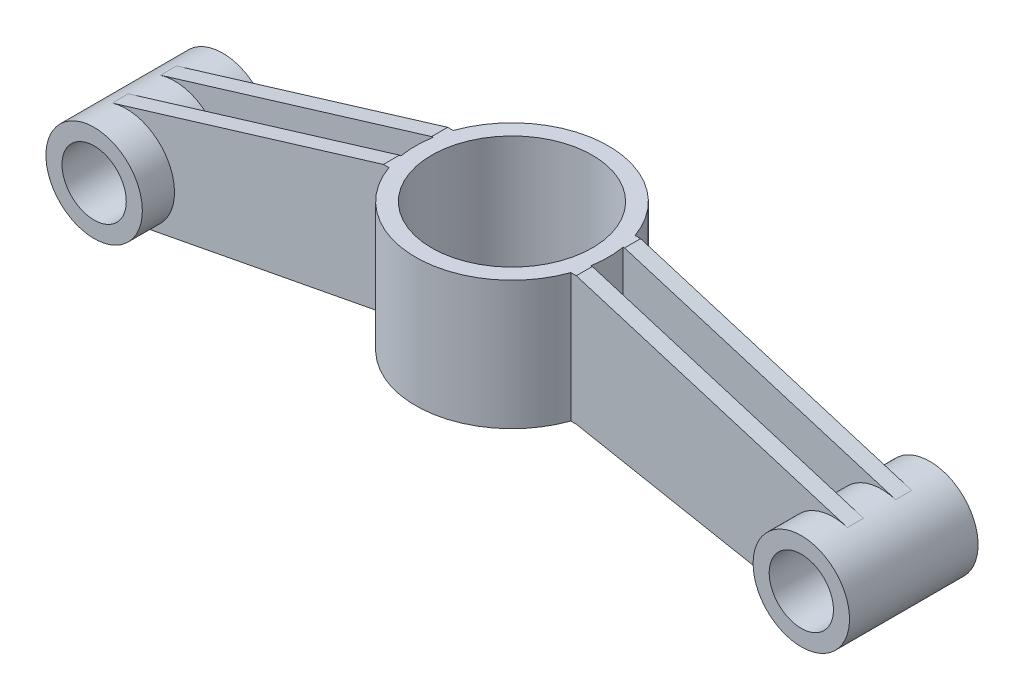
ISO-10303-21;
HEADER;
FILE_DESCRIPTION(('STEP AP214'),'2;1');
FILE_NAME('part.step','',(''),(''),'','','');
FILE_SCHEMA(('AUTOMOTIVE_DESIGN { 1 0 10303 214 1 1 1 1 }'));
ENDSEC;
DATA;
#1=APPLICATION_CONTEXT('core data for automotive mechanical design processes');
#2=APPLICATION_PROTOCOL_DEFINITION('international standard','automotive_design',2000,#1);
#3=PRODUCT_CONTEXT('',#1,'mechanical');
#4=PRODUCT('Part','Part','',(#3));
#5=PRODUCT_RELATED_PRODUCT_CATEGORY('part','',(#4));
#6=PRODUCT_DEFINITION_FORMATION('','',#4);
#7=PRODUCT_DEFINITION_CONTEXT('part definition',#1,'design');
#8=PRODUCT_DEFINITION('design','',#6,#7);
#9=PRODUCT_DEFINITION_SHAPE('','',#8);
#10=(LENGTH_UNIT() NAMED_UNIT(*) SI_UNIT(.MILLI.,.METRE.));
#11=(NAMED_UNIT(*) PLANE_ANGLE_UNIT() SI_UNIT($,.RADIAN.));
#12=(NAMED_UNIT(*) SI_UNIT($,.STERADIAN.) SOLID_ANGLE_UNIT());
#13=UNCERTAINTY_MEASURE_WITH_UNIT(LENGTH_MEASURE(1.E-05),#10,'distance_accuracy_value','');
#14=(GEOMETRIC_REPRESENTATION_CONTEXT(3) GLOBAL_UNCERTAINTY_ASSIGNED_CONTEXT((#13)) GLOBAL_UNIT_ASSIGNED_CONTEXT((#10,
#11,#12)) REPRESENTATION_CONTEXT('',''));
#15=CARTESIAN_POINT('',(0.,0.,0.));
#16=DIRECTION('',(0.,0.,1.));
#17=DIRECTION('',(1.,0.,0.));
#18=AXIS2_PLACEMENT_3D('',#15,#16,#17);
#19=CARTESIAN_POINT('',(-110.,0.,10.));
#20=DIRECTION('',(0.,0.,1.));
#21=DIRECTION('',(1.,0.,0.));
#22=AXIS2_PLACEMENT_3D('',#19,#20,#21);
#23=PLANE('',#22);
#24=DIRECTION('',(1.,0.,0.));
#25=VECTOR('',#24,1.);
#26=CARTESIAN_POINT('',(-25.,0.,10.));
#27=LINE('',#26,#25);
#28=CARTESIAN_POINT('',(-30.,0.,10.));
#29=VERTEX_POINT('',#28);
#30=CARTESIAN_POINT('',(-28.2842712474619,0.,10.));
#31=VERTEX_POINT('',#30);
#32=EDGE_CURVE('E348',#29,#31,#27,.T.);
#33=ORIENTED_EDGE('',*,*,#32,.T.);
#34=DIRECTION('',(0.,-1.,0.));
#35=VECTOR('',#34,1.);
#36=CARTESIAN_POINT('',(-28.2842712474619,40.,10.));
#37=LINE('',#36,#35);
#38=CARTESIAN_POINT('',(-28.2842712474619,40.,10.));
#39=VERTEX_POINT('',#38);
#40=EDGE_CURVE('E286',#31,#39,#37,.F.);
#41=ORIENTED_EDGE('',*,*,#40,.T.);
#42=DIRECTION('',(-1.,0.,0.));
#43=VECTOR('',#42,1.);
#44=CARTESIAN_POINT('',(-30.,40.,10.));
#45=LINE('',#44,#43);
#46=CARTESIAN_POINT('',(-30.,40.,10.));
#47=VERTEX_POINT('',#46);
#48=EDGE_CURVE('E352',#39,#47,#45,.T.);
#49=ORIENTED_EDGE('',*,*,#48,.T.);
#50=DIRECTION('',(-0.95675960442742,-0.29087980221371,0.));
#51=VECTOR('',#50,1.);
#52=CARTESIAN_POINT('',(-114.363197033206,14.3513940664113,10.));
#53=LINE('',#52,#51);
#54=CARTESIAN_POINT('',(-114.363197033206,14.3513940664113,10.));
#55=VERTEX_POINT('',#54);
#56=EDGE_CURVE('E355',#47,#55,#53,.T.);
#57=ORIENTED_EDGE('',*,*,#56,.T.);
#58=CARTESIAN_POINT('',(-110.,0.,10.));
#59=DIRECTION('',(0.,0.,-1.));
#60=DIRECTION('',(1.,0.,0.));
#61=AXIS2_PLACEMENT_3D('',#58,#59,#60);
#62=CIRCLE('',#61,15.);
#63=CARTESIAN_POINT('',(-107.1875,-14.7339690426579,10.));
#64=VERTEX_POINT('',#63);
#65=EDGE_CURVE('E340',#55,#64,#62,.T.);
#66=ORIENTED_EDGE('',*,*,#65,.T.);
#67=DIRECTION('',(0.982264602843857,0.1875,0.));
#68=VECTOR('',#67,1.);
#69=CARTESIAN_POINT('',(-30.,0.,10.));
#70=LINE('',#69,#68);
#71=EDGE_CURVE('E344',#64,#29,#70,.T.);
#72=ORIENTED_EDGE('',*,*,#71,.T.);
#73=EDGE_LOOP('',(#33,#41,#49,#57,#66,#72));
#74=FACE_BOUND('',#73,.T.);
#75=ADVANCED_FACE('F47',(#74),#23,.T.);
#76=CARTESIAN_POINT('',(-110.,0.,5.));
#77=DIRECTION('',(0.,0.,1.));
#78=DIRECTION('',(1.,0.,0.));
#79=AXIS2_PLACEMENT_3D('',#76,#77,#78);
#80=PLANE('',#79);
#81=DIRECTION('',(0.,-1.,0.));
#82=VECTOR('',#81,1.);
#83=CARTESIAN_POINT('',(-29.5803989154981,40.,5.));
#84=LINE('',#83,#82);
#85=CARTESIAN_POINT('',(-29.5803989154981,0.,5.));
#86=VERTEX_POINT('',#85);
#87=CARTESIAN_POINT('',(-29.5803989154981,40.,5.));
#88=VERTEX_POINT('',#87);
#89=EDGE_CURVE('E283',#86,#88,#84,.F.);
#90=ORIENTED_EDGE('',*,*,#89,.F.);
#91=DIRECTION('',(1.,0.,0.));
#92=VECTOR('',#91,1.);
#93=CARTESIAN_POINT('',(-25.,0.,5.));
#94=LINE('',#93,#92);
#95=CARTESIAN_POINT('',(-30.,0.,5.));
#96=VERTEX_POINT('',#95);
#97=EDGE_CURVE('E365',#96,#86,#94,.T.);
#98=ORIENTED_EDGE('',*,*,#97,.F.);
#99=DIRECTION('',(0.982264602843857,0.1875,0.));
#100=VECTOR('',#99,1.);
#101=CARTESIAN_POINT('',(-30.,0.,5.));
#102=LINE('',#101,#100);
#103=CARTESIAN_POINT('',(-107.1875,-14.7339690426579,5.));
#104=VERTEX_POINT('',#103);
#105=EDGE_CURVE('E362',#104,#96,#102,.T.);
#106=ORIENTED_EDGE('',*,*,#105,.F.);
#107=CARTESIAN_POINT('',(-110.,0.,5.));
#108=DIRECTION('',(0.,0.,-1.));
#109=DIRECTION('',(1.,0.,0.));
#110=AXIS2_PLACEMENT_3D('',#107,#108,#109);
#111=CIRCLE('',#110,15.);
#112=CARTESIAN_POINT('',(-114.363197033206,14.3513940664113,5.));
#113=VERTEX_POINT('',#112);
#114=EDGE_CURVE('E339',#113,#104,#111,.T.);
#115=ORIENTED_EDGE('',*,*,#114,.F.);
#116=DIRECTION('',(-0.95675960442742,-0.29087980221371,0.));
#117=VECTOR('',#116,1.);
#118=CARTESIAN_POINT('',(-114.363197033206,14.3513940664113,5.));
#119=LINE('',#118,#117);
#120=CARTESIAN_POINT('',(-30.,40.,5.));
#121=VERTEX_POINT('',#120);
#122=EDGE_CURVE('E345',#121,#113,#119,.T.);
#123=ORIENTED_EDGE('',*,*,#122,.F.);
#124=DIRECTION('',(-1.,0.,0.));
#125=VECTOR('',#124,1.);
#126=CARTESIAN_POINT('',(-30.,40.,5.));
#127=LINE('',#126,#125);
#128=EDGE_CURVE('E369',#88,#121,#127,.T.);
#129=ORIENTED_EDGE('',*,*,#128,.F.);
#130=EDGE_LOOP('',(#90,#98,#106,#115,#123,#129));
#131=FACE_BOUND('',#130,.T.);
#132=ADVANCED_FACE('F416',(#131),#80,.F.);
#133=CARTESIAN_POINT('',(-110.,0.,-10.));
#134=DIRECTION('',(0.,0.,-1.));
#135=DIRECTION('',(1.,0.,0.));
#136=AXIS2_PLACEMENT_3D('',#133,#134,#135);
#137=PLANE('',#136);
#138=DIRECTION('',(-1.,0.,0.));
#139=VECTOR('',#138,1.);
#140=CARTESIAN_POINT('',(-30.,40.,-10.));
#141=LINE('',#140,#139);
#142=CARTESIAN_POINT('',(-28.2842712474619,40.,-10.));
#143=VERTEX_POINT('',#142);
#144=CARTESIAN_POINT('',(-30.,40.,-10.));
#145=VERTEX_POINT('',#144);
#146=EDGE_CURVE('E68',#143,#145,#141,.T.);
#147=ORIENTED_EDGE('',*,*,#146,.F.);
#148=DIRECTION('',(0.,-1.,0.));
#149=VECTOR('',#148,1.);
#150=CARTESIAN_POINT('',(-28.2842712474619,40.,-10.));
#151=LINE('',#150,#149);
#152=CARTESIAN_POINT('',(-28.2842712474619,0.,-10.));
#153=VERTEX_POINT('',#152);
#154=EDGE_CURVE('E63',#153,#143,#151,.F.);
#155=ORIENTED_EDGE('',*,*,#154,.F.);
#156=DIRECTION('',(1.,0.,0.));
#157=VECTOR('',#156,1.);
#158=CARTESIAN_POINT('',(-25.,0.,-10.));
#159=LINE('',#158,#157);
#160=CARTESIAN_POINT('',(-30.,0.,-10.));
#161=VERTEX_POINT('',#160);
#162=EDGE_CURVE('E327',#161,#153,#159,.T.);
#163=ORIENTED_EDGE('',*,*,#162,.F.);
#164=DIRECTION('',(0.982264602843857,0.1875,0.));
#165=VECTOR('',#164,1.);
#166=CARTESIAN_POINT('',(-30.,0.,-10.));
#167=LINE('',#166,#165);
#168=CARTESIAN_POINT('',(-107.1875,-14.7339690426579,-10.));
#169=VERTEX_POINT('',#168);
#170=EDGE_CURVE('E323',#169,#161,#167,.T.);
#171=ORIENTED_EDGE('',*,*,#170,.F.);
#172=CARTESIAN_POINT('',(-110.,0.,-10.));
#173=DIRECTION('',(0.,0.,-1.));
#174=DIRECTION('',(1.,0.,0.));
#175=AXIS2_PLACEMENT_3D('',#172,#173,#174);
#176=CIRCLE('',#175,15.);
#177=CARTESIAN_POINT('',(-114.363197033206,14.3513940664113,-10.));
#178=VERTEX_POINT('',#177);
#179=EDGE_CURVE('E320',#178,#169,#176,.T.);
#180=ORIENTED_EDGE('',*,*,#179,.F.);
#181=DIRECTION('',(-0.95675960442742,-0.29087980221371,0.));
#182=VECTOR('',#181,1.);
#183=CARTESIAN_POINT('',(-114.363197033206,14.3513940664113,-10.));
#184=LINE('',#183,#182);
#185=EDGE_CURVE('E312',#145,#178,#184,.T.);
#186=ORIENTED_EDGE('',*,*,#185,.F.);
#187=EDGE_LOOP('',(#147,#155,#163,#171,#180,#186));
#188=FACE_BOUND('',#187,.T.);
#189=ADVANCED_FACE('F423',(#188),#137,.T.);
#190=CARTESIAN_POINT('',(-110.,0.,-5.));
#191=DIRECTION('',(0.,0.,-1.));
#192=DIRECTION('',(1.,0.,0.));
#193=AXIS2_PLACEMENT_3D('',#190,#191,#192);
#194=PLANE('',#193);
#195=DIRECTION('',(0.,-1.,0.));
#196=VECTOR('',#195,1.);
#197=CARTESIAN_POINT('',(-29.5803989154981,40.,-5.));
#198=LINE('',#197,#196);
#199=CARTESIAN_POINT('',(-29.5803989154981,0.,-5.));
#200=VERTEX_POINT('',#199);
#201=CARTESIAN_POINT('',(-29.5803989154981,40.,-5.));
#202=VERTEX_POINT('',#201);
#203=EDGE_CURVE('E265',#200,#202,#198,.F.);
#204=ORIENTED_EDGE('',*,*,#203,.T.);
#205=DIRECTION('',(-1.,0.,0.));
#206=VECTOR('',#205,1.);
#207=CARTESIAN_POINT('',(-30.,40.,-5.));
#208=LINE('',#207,#206);
#209=CARTESIAN_POINT('',(-30.,40.,-5.));
#210=VERTEX_POINT('',#209);
#211=EDGE_CURVE('E298',#202,#210,#208,.T.);
#212=ORIENTED_EDGE('',*,*,#211,.T.);
#213=DIRECTION('',(-0.95675960442742,-0.29087980221371,0.));
#214=VECTOR('',#213,1.);
#215=CARTESIAN_POINT('',(-114.363197033206,14.3513940664113,-5.));
#216=LINE('',#215,#214);
#217=CARTESIAN_POINT('',(-114.363197033206,14.3513940664113,-5.));
#218=VERTEX_POINT('',#217);
#219=EDGE_CURVE('E294',#210,#218,#216,.T.);
#220=ORIENTED_EDGE('',*,*,#219,.T.);
#221=CARTESIAN_POINT('',(-110.,0.,-5.));
#222=DIRECTION('',(0.,0.,-1.));
#223=DIRECTION('',(1.,0.,0.));
#224=AXIS2_PLACEMENT_3D('',#221,#222,#223);
#225=CIRCLE('',#224,15.);
#226=CARTESIAN_POINT('',(-107.1875,-14.7339690426579,-5.));
#227=VERTEX_POINT('',#226);
#228=EDGE_CURVE('E290',#218,#227,#225,.T.);
#229=ORIENTED_EDGE('',*,*,#228,.T.);
#230=DIRECTION('',(0.982264602843857,0.1875,0.));
#231=VECTOR('',#230,1.);
#232=CARTESIAN_POINT('',(-30.,0.,-5.));
#233=LINE('',#232,#231);
#234=CARTESIAN_POINT('',(-30.,0.,-5.));
#235=VERTEX_POINT('',#234);
#236=EDGE_CURVE('E304',#227,#235,#233,.T.);
#237=ORIENTED_EDGE('',*,*,#236,.T.);
#238=DIRECTION('',(1.,0.,0.));
#239=VECTOR('',#238,1.);
#240=CARTESIAN_POINT('',(-25.,0.,-5.));
#241=LINE('',#240,#239);
#242=EDGE_CURVE('E301',#235,#200,#241,.T.);
#243=ORIENTED_EDGE('',*,*,#242,.T.);
#244=EDGE_LOOP('',(#204,#212,#220,#229,#237,#243));
#245=FACE_BOUND('',#244,.T.);
#246=ADVANCED_FACE('F467',(#245),#194,.F.);
#247=CARTESIAN_POINT('',(-110.,0.,20.));
#248=DIRECTION('',(0.,0.,-1.));
#249=DIRECTION('',(-1.,0.,0.));
#250=AXIS2_PLACEMENT_3D('',#247,#248,#249);
#251=CYLINDRICAL_SURFACE('',#250,15.);
#252=CARTESIAN_POINT('',(-110.,0.,-20.));
#253=DIRECTION('',(0.,0.,1.));
#254=DIRECTION('',(1.,0.,0.));
#255=AXIS2_PLACEMENT_3D('',#252,#253,#254);
#256=CIRCLE('',#255,15.);
#257=CARTESIAN_POINT('',(-95.,0.,-20.));
#258=VERTEX_POINT('',#257);
#259=EDGE_CURVE('E51',#258,#258,#256,.T.);
#260=ORIENTED_EDGE('',*,*,#259,.T.);
#261=EDGE_LOOP('',(#260));
#262=FACE_BOUND('',#261,.T.);
#263=CARTESIAN_POINT('',(-110.,0.,20.));
#264=DIRECTION('',(0.,0.,1.));
#265=DIRECTION('',(1.,0.,0.));
#266=AXIS2_PLACEMENT_3D('',#263,#264,#265);
#267=CIRCLE('',#266,15.);
#268=CARTESIAN_POINT('',(-95.,0.,20.));
#269=VERTEX_POINT('',#268);
#270=EDGE_CURVE('E11',#269,#269,#267,.T.);
#271=ORIENTED_EDGE('',*,*,#270,.F.);
#272=EDGE_LOOP('',(#271));
#273=FACE_BOUND('',#272,.T.);
#274=DIRECTION('',(0.,0.,-1.));
#275=VECTOR('',#274,1.);
#276=CARTESIAN_POINT('',(-107.1875,-14.7339690426579,10.));
#277=LINE('',#276,#275);
#278=EDGE_CURVE('E385',#64,#104,#277,.T.);
#279=ORIENTED_EDGE('',*,*,#278,.F.);
#280=ORIENTED_EDGE('',*,*,#65,.F.);
#281=DIRECTION('',(0.,0.,-1.));
#282=VECTOR('',#281,1.);
#283=CARTESIAN_POINT('',(-114.363197033206,14.3513940664113,10.));
#284=LINE('',#283,#282);
#285=EDGE_CURVE('E359',#55,#113,#284,.T.);
#286=ORIENTED_EDGE('',*,*,#285,.T.);
#287=ORIENTED_EDGE('',*,*,#114,.T.);
#288=EDGE_LOOP('',(#279,#280,#286,#287));
#289=FACE_BOUND('',#288,.T.);
#290=DIRECTION('',(0.,0.,1.));
#291=VECTOR('',#290,1.);
#292=CARTESIAN_POINT('',(-107.1875,-14.7339690426579,-10.));
#293=LINE('',#292,#291);
#294=EDGE_CURVE('E336',#169,#227,#293,.T.);
#295=ORIENTED_EDGE('',*,*,#294,.T.);
#296=ORIENTED_EDGE('',*,*,#228,.F.);
#297=DIRECTION('',(0.,0.,1.));
#298=VECTOR('',#297,1.);
#299=CARTESIAN_POINT('',(-114.363197033206,14.3513940664113,-10.));
#300=LINE('',#299,#298);
#301=EDGE_CURVE('E308',#178,#218,#300,.T.);
#302=ORIENTED_EDGE('',*,*,#301,.F.);
#303=ORIENTED_EDGE('',*,*,#179,.T.);
#304=EDGE_LOOP('',(#295,#296,#302,#303));
#305=FACE_BOUND('',#304,.T.);
#306=ADVANCED_FACE('F49',(#262,#273,#289,#305),#251,.T.);
#307=CARTESIAN_POINT('',(-110.,0.,20.));
#308=DIRECTION('',(0.,0.,1.));
#309=DIRECTION('',(1.,0.,0.));
#310=AXIS2_PLACEMENT_3D('',#307,#308,#309);
#311=PLANE('',#310);
#312=ORIENTED_EDGE('',*,*,#270,.T.);
#313=EDGE_LOOP('',(#312));
#314=FACE_BOUND('',#313,.T.);
#315=CARTESIAN_POINT('',(-110.,0.,20.));
#316=DIRECTION('',(0.,0.,1.));
#317=DIRECTION('',(1.,0.,0.));
#318=AXIS2_PLACEMENT_3D('',#315,#316,#317);
#319=CIRCLE('',#318,9.99999999999999);
#320=CARTESIAN_POINT('',(-100.,0.,20.));
#321=VERTEX_POINT('',#320);
#322=EDGE_CURVE('E390',#321,#321,#319,.T.);
#323=ORIENTED_EDGE('',*,*,#322,.F.);
#324=EDGE_LOOP('',(#323));
#325=FACE_BOUND('',#324,.T.);
#326=ADVANCED_FACE('F412',(#314,#325),#311,.T.);
#327=CARTESIAN_POINT('',(-110.,0.,-20.));
#328=DIRECTION('',(0.,0.,1.));
#329=DIRECTION('',(1.,0.,0.));
#330=AXIS2_PLACEMENT_3D('',#327,#328,#329);
#331=PLANE('',#330);
#332=ORIENTED_EDGE('',*,*,#259,.F.);
#333=EDGE_LOOP('',(#332));
#334=FACE_BOUND('',#333,.T.);
#335=CARTESIAN_POINT('',(-110.,0.,-20.));
#336=DIRECTION('',(0.,0.,1.));
#337=DIRECTION('',(1.,0.,0.));
#338=AXIS2_PLACEMENT_3D('',#335,#336,#337);
#339=CIRCLE('',#338,9.99999999999999);
#340=CARTESIAN_POINT('',(-100.,0.,-20.));
#341=VERTEX_POINT('',#340);
#342=EDGE_CURVE('E389',#341,#341,#339,.T.);
#343=ORIENTED_EDGE('',*,*,#342,.T.);
#344=EDGE_LOOP('',(#343));
#345=FACE_BOUND('',#344,.T.);
#346=ADVANCED_FACE('F398',(#334,#345),#331,.F.);
#347=CARTESIAN_POINT('',(-110.,0.,20.));
#348=DIRECTION('',(0.,0.,-1.));
#349=DIRECTION('',(-1.,0.,0.));
#350=AXIS2_PLACEMENT_3D('',#347,#348,#349);
#351=CYLINDRICAL_SURFACE('',#350,9.99999999999999);
#352=ORIENTED_EDGE('',*,*,#322,.T.);
#353=EDGE_LOOP('',(#352));
#354=FACE_BOUND('',#353,.T.);
#355=ORIENTED_EDGE('',*,*,#342,.F.);
#356=EDGE_LOOP('',(#355));
#357=FACE_BOUND('',#356,.T.);
#358=ADVANCED_FACE('F400',(#354,#357),#351,.F.);
#359=CARTESIAN_POINT('',(-30.,0.,10.));
#360=DIRECTION('',(-0.1875,0.982264602843857,0.));
#361=DIRECTION('',(-0.982264602843857,-0.1875,0.));
#362=AXIS2_PLACEMENT_3D('',#359,#360,#361);
#363=PLANE('',#362);
#364=ORIENTED_EDGE('',*,*,#105,.T.);
#365=DIRECTION('',(0.,0.,-1.));
#366=VECTOR('',#365,1.);
#367=CARTESIAN_POINT('',(-30.,0.,10.));
#368=LINE('',#367,#366);
#369=EDGE_CURVE('E381',#29,#96,#368,.T.);
#370=ORIENTED_EDGE('',*,*,#369,.F.);
#371=ORIENTED_EDGE('',*,*,#71,.F.);
#372=ORIENTED_EDGE('',*,*,#278,.T.);
#373=EDGE_LOOP('',(#364,#370,#371,#372));
#374=FACE_BOUND('',#373,.T.);
#375=ADVANCED_FACE('F402',(#374),#363,.F.);
#376=CARTESIAN_POINT('',(-25.,0.,10.));
#377=DIRECTION('',(0.,1.,0.));
#378=DIRECTION('',(0.,0.,1.));
#379=AXIS2_PLACEMENT_3D('',#376,#377,#378);
#380=PLANE('',#379);
#381=ORIENTED_EDGE('',*,*,#97,.T.);
#382=CARTESIAN_POINT('',(0.,0.,0.));
#383=DIRECTION('',(0.,1.,0.));
#384=DIRECTION('',(0.,0.,1.));
#385=AXIS2_PLACEMENT_3D('',#382,#383,#384);
#386=CIRCLE('',#385,30.);
#387=EDGE_CURVE('E268',#200,#86,#386,.T.);
#388=ORIENTED_EDGE('',*,*,#387,.F.);
#389=ORIENTED_EDGE('',*,*,#242,.F.);
#390=DIRECTION('',(0.,0.,1.));
#391=VECTOR('',#390,1.);
#392=CARTESIAN_POINT('',(-30.,0.,-10.));
#393=LINE('',#392,#391);
#394=EDGE_CURVE('E332',#161,#235,#393,.T.);
#395=ORIENTED_EDGE('',*,*,#394,.F.);
#396=ORIENTED_EDGE('',*,*,#162,.T.);
#397=CARTESIAN_POINT('',(28.2842712474619,0.,-10.));
#398=VERTEX_POINT('',#397);
#399=EDGE_CURVE('E257',#398,#153,#386,.T.);
#400=ORIENTED_EDGE('',*,*,#399,.F.);
#401=DIRECTION('',(1.,0.,0.));
#402=VECTOR('',#401,1.);
#403=CARTESIAN_POINT('',(25.,0.,-10.));
#404=LINE('',#403,#402);
#405=CARTESIAN_POINT('',(30.,0.,-10.));
#406=VERTEX_POINT('',#405);
#407=EDGE_CURVE('E744',#398,#406,#404,.T.);
#408=ORIENTED_EDGE('',*,*,#407,.T.);
#409=DIRECTION('',(0.,0.,1.));
#410=VECTOR('',#409,1.);
#411=CARTESIAN_POINT('',(30.,0.,-10.));
#412=LINE('',#411,#410);
#413=CARTESIAN_POINT('',(30.,0.,-5.));
#414=VERTEX_POINT('',#413);
#415=EDGE_CURVE('E244',#406,#414,#412,.T.);
#416=ORIENTED_EDGE('',*,*,#415,.T.);
#417=DIRECTION('',(1.,0.,0.));
#418=VECTOR('',#417,1.);
#419=CARTESIAN_POINT('',(25.,0.,-5.));
#420=LINE('',#419,#418);
#421=CARTESIAN_POINT('',(29.5803989154981,0.,-5.));
#422=VERTEX_POINT('',#421);
#423=EDGE_CURVE('E760',#422,#414,#420,.T.);
#424=ORIENTED_EDGE('',*,*,#423,.F.);
#425=CARTESIAN_POINT('',(29.5803989154981,0.,5.));
#426=VERTEX_POINT('',#425);
#427=EDGE_CURVE('E737',#426,#422,#386,.T.);
#428=ORIENTED_EDGE('',*,*,#427,.F.);
#429=DIRECTION('',(1.,0.,0.));
#430=VECTOR('',#429,1.);
#431=CARTESIAN_POINT('',(25.,0.,5.));
#432=LINE('',#431,#430);
#433=CARTESIAN_POINT('',(30.,0.,5.));
#434=VERTEX_POINT('',#433);
#435=EDGE_CURVE('E786',#426,#434,#432,.T.);
#436=ORIENTED_EDGE('',*,*,#435,.T.);
#437=DIRECTION('',(0.,0.,-1.));
#438=VECTOR('',#437,1.);
#439=CARTESIAN_POINT('',(30.,0.,10.));
#440=LINE('',#439,#438);
#441=CARTESIAN_POINT('',(30.,0.,10.));
#442=VERTEX_POINT('',#441);
#443=EDGE_CURVE('E834',#442,#434,#440,.T.);
#444=ORIENTED_EDGE('',*,*,#443,.F.);
#445=DIRECTION('',(1.,0.,0.));
#446=VECTOR('',#445,1.);
#447=CARTESIAN_POINT('',(25.,0.,10.));
#448=LINE('',#447,#446);
#449=CARTESIAN_POINT('',(28.2842712474619,0.,10.));
#450=VERTEX_POINT('',#449);
#451=EDGE_CURVE('E735',#450,#442,#448,.T.);
#452=ORIENTED_EDGE('',*,*,#451,.F.);
#453=EDGE_CURVE('E271',#31,#450,#386,.T.);
#454=ORIENTED_EDGE('',*,*,#453,.F.);
#455=ORIENTED_EDGE('',*,*,#32,.F.);
#456=ORIENTED_EDGE('',*,*,#369,.T.);
#457=EDGE_LOOP('',(#381,#388,#389,#395,#396,#400,#408,#416,#424,#428,#436,#444,#452,#454,#455,#456));
#458=FACE_BOUND('',#457,.T.);
#459=CARTESIAN_POINT('',(0.,0.,0.));
#460=DIRECTION('',(0.,1.,0.));
#461=DIRECTION('',(0.,0.,1.));
#462=AXIS2_PLACEMENT_3D('',#459,#460,#461);
#463=CIRCLE('',#462,25.);
#464=CARTESIAN_POINT('',(0.,0.,25.));
#465=VERTEX_POINT('',#464);
#466=EDGE_CURVE('E252',#465,#465,#463,.T.);
#467=ORIENTED_EDGE('',*,*,#466,.T.);
#468=EDGE_LOOP('',(#467));
#469=FACE_BOUND('',#468,.T.);
#470=ADVANCED_FACE('F409',(#458,#469),#380,.F.);
#471=CARTESIAN_POINT('',(-30.,40.,10.));
#472=DIRECTION('',(0.,-1.,0.));
#473=DIRECTION('',(0.,0.,-1.));
#474=AXIS2_PLACEMENT_3D('',#471,#472,#473);
#475=PLANE('',#474);
#476=ORIENTED_EDGE('',*,*,#48,.F.);
#477=CARTESIAN_POINT('',(0.,40.,0.));
#478=DIRECTION('',(0.,1.,0.));
#479=DIRECTION('',(0.,0.,1.));
#480=AXIS2_PLACEMENT_3D('',#477,#478,#479);
#481=CIRCLE('',#480,30.);
#482=CARTESIAN_POINT('',(28.2842712474619,40.,10.));
#483=VERTEX_POINT('',#482);
#484=EDGE_CURVE('E266',#39,#483,#481,.T.);
#485=ORIENTED_EDGE('',*,*,#484,.T.);
#486=DIRECTION('',(-1.,0.,0.));
#487=VECTOR('',#486,1.);
#488=CARTESIAN_POINT('',(30.,40.,10.));
#489=LINE('',#488,#487);
#490=CARTESIAN_POINT('',(30.,40.,10.));
#491=VERTEX_POINT('',#490);
#492=EDGE_CURVE('E804',#491,#483,#489,.T.);
#493=ORIENTED_EDGE('',*,*,#492,.F.);
#494=DIRECTION('',(0.,0.,-1.));
#495=VECTOR('',#494,1.);
#496=CARTESIAN_POINT('',(30.,40.,10.));
#497=LINE('',#496,#495);
#498=CARTESIAN_POINT('',(30.,40.,5.));
#499=VERTEX_POINT('',#498);
#500=EDGE_CURVE('E808',#491,#499,#497,.T.);
#501=ORIENTED_EDGE('',*,*,#500,.T.);
#502=DIRECTION('',(-1.,0.,0.));
#503=VECTOR('',#502,1.);
#504=CARTESIAN_POINT('',(30.,40.,5.));
#505=LINE('',#504,#503);
#506=CARTESIAN_POINT('',(29.5803989154981,40.,5.));
#507=VERTEX_POINT('',#506);
#508=EDGE_CURVE('E792',#499,#507,#505,.T.);
#509=ORIENTED_EDGE('',*,*,#508,.T.);
#510=CARTESIAN_POINT('',(29.5803989154981,40.,-5.));
#511=VERTEX_POINT('',#510);
#512=EDGE_CURVE('E847',#507,#511,#481,.T.);
#513=ORIENTED_EDGE('',*,*,#512,.T.);
#514=DIRECTION('',(-1.,0.,0.));
#515=VECTOR('',#514,1.);
#516=CARTESIAN_POINT('',(30.,40.,-5.));
#517=LINE('',#516,#515);
#518=CARTESIAN_POINT('',(30.,40.,-5.));
#519=VERTEX_POINT('',#518);
#520=EDGE_CURVE('E220',#519,#511,#517,.T.);
#521=ORIENTED_EDGE('',*,*,#520,.F.);
#522=DIRECTION('',(0.,0.,1.));
#523=VECTOR('',#522,1.);
#524=CARTESIAN_POINT('',(30.,40.,-10.));
#525=LINE('',#524,#523);
#526=CARTESIAN_POINT('',(30.,40.,-10.));
#527=VERTEX_POINT('',#526);
#528=EDGE_CURVE('E231',#527,#519,#525,.T.);
#529=ORIENTED_EDGE('',*,*,#528,.F.);
#530=DIRECTION('',(-1.,0.,0.));
#531=VECTOR('',#530,1.);
#532=CARTESIAN_POINT('',(30.,40.,-10.));
#533=LINE('',#532,#531);
#534=CARTESIAN_POINT('',(28.2842712474619,40.,-10.));
#535=VERTEX_POINT('',#534);
#536=EDGE_CURVE('E754',#527,#535,#533,.T.);
#537=ORIENTED_EDGE('',*,*,#536,.T.);
#538=EDGE_CURVE('E267',#535,#143,#481,.T.);
#539=ORIENTED_EDGE('',*,*,#538,.T.);
#540=ORIENTED_EDGE('',*,*,#146,.T.);
#541=DIRECTION('',(0.,0.,1.));
#542=VECTOR('',#541,1.);
#543=CARTESIAN_POINT('',(-30.,40.,-10.));
#544=LINE('',#543,#542);
#545=EDGE_CURVE('E316',#145,#210,#544,.T.);
#546=ORIENTED_EDGE('',*,*,#545,.T.);
#547=ORIENTED_EDGE('',*,*,#211,.F.);
#548=EDGE_CURVE('E261',#202,#88,#481,.T.);
#549=ORIENTED_EDGE('',*,*,#548,.T.);
#550=ORIENTED_EDGE('',*,*,#128,.T.);
#551=DIRECTION('',(0.,0.,-1.));
#552=VECTOR('',#551,1.);
#553=CARTESIAN_POINT('',(-30.,40.,10.));
#554=LINE('',#553,#552);
#555=EDGE_CURVE('E377',#47,#121,#554,.T.);
#556=ORIENTED_EDGE('',*,*,#555,.F.);
#557=EDGE_LOOP('',(#476,#485,#493,#501,#509,#513,#521,#529,#537,#539,#540,#546,#547,#549,#550,#556));
#558=FACE_BOUND('',#557,.T.);
#559=CARTESIAN_POINT('',(0.,40.,0.));
#560=DIRECTION('',(0.,1.,0.));
#561=DIRECTION('',(0.,0.,1.));
#562=AXIS2_PLACEMENT_3D('',#559,#560,#561);
#563=CIRCLE('',#562,25.);
#564=CARTESIAN_POINT('',(0.,40.,25.));
#565=VERTEX_POINT('',#564);
#566=EDGE_CURVE('E253',#565,#565,#563,.T.);
#567=ORIENTED_EDGE('',*,*,#566,.F.);
#568=EDGE_LOOP('',(#567));
#569=FACE_BOUND('',#568,.T.);
#570=ADVANCED_FACE('F432',(#558,#569),#475,.F.);
#571=CARTESIAN_POINT('',(-114.363197033206,14.3513940664113,10.));
#572=DIRECTION('',(0.29087980221371,-0.95675960442742,0.));
#573=DIRECTION('',(0.95675960442742,0.29087980221371,0.));
#574=AXIS2_PLACEMENT_3D('',#571,#572,#573);
#575=PLANE('',#574);
#576=ORIENTED_EDGE('',*,*,#122,.T.);
#577=ORIENTED_EDGE('',*,*,#285,.F.);
#578=ORIENTED_EDGE('',*,*,#56,.F.);
#579=ORIENTED_EDGE('',*,*,#555,.T.);
#580=EDGE_LOOP('',(#576,#577,#578,#579));
#581=FACE_BOUND('',#580,.T.);
#582=ADVANCED_FACE('F430',(#581),#575,.F.);
#583=CARTESIAN_POINT('',(-30.,0.,-10.));
#584=DIRECTION('',(-0.1875,0.982264602843857,0.));
#585=DIRECTION('',(-0.982264602843857,-0.1875,0.));
#586=AXIS2_PLACEMENT_3D('',#583,#584,#585);
#587=PLANE('',#586);
#588=ORIENTED_EDGE('',*,*,#236,.F.);
#589=ORIENTED_EDGE('',*,*,#294,.F.);
#590=ORIENTED_EDGE('',*,*,#170,.T.);
#591=ORIENTED_EDGE('',*,*,#394,.T.);
#592=EDGE_LOOP('',(#588,#589,#590,#591));
#593=FACE_BOUND('',#592,.T.);
#594=ADVANCED_FACE('F427',(#593),#587,.F.);
#595=CARTESIAN_POINT('',(-114.363197033206,14.3513940664113,-10.));
#596=DIRECTION('',(0.29087980221371,-0.95675960442742,0.));
#597=DIRECTION('',(0.95675960442742,0.29087980221371,0.));
#598=AXIS2_PLACEMENT_3D('',#595,#596,#597);
#599=PLANE('',#598);
#600=ORIENTED_EDGE('',*,*,#219,.F.);
#601=ORIENTED_EDGE('',*,*,#545,.F.);
#602=ORIENTED_EDGE('',*,*,#185,.T.);
#603=ORIENTED_EDGE('',*,*,#301,.T.);
#604=EDGE_LOOP('',(#600,#601,#602,#603));
#605=FACE_BOUND('',#604,.T.);
#606=ADVANCED_FACE('F471',(#605),#599,.F.);
#607=CARTESIAN_POINT('',(0.,40.,0.));
#608=DIRECTION('',(0.,-1.,0.));
#609=DIRECTION('',(0.,0.,-1.));
#610=AXIS2_PLACEMENT_3D('',#607,#608,#609);
#611=CYLINDRICAL_SURFACE('',#610,30.);
#612=ORIENTED_EDGE('',*,*,#387,.T.);
#613=ORIENTED_EDGE('',*,*,#89,.T.);
#614=ORIENTED_EDGE('',*,*,#548,.F.);
#615=ORIENTED_EDGE('',*,*,#203,.F.);
#616=EDGE_LOOP('',(#612,#613,#614,#615));
#617=FACE_BOUND('',#616,.T.);
#618=ADVANCED_FACE('F462',(#617),#611,.T.);
#619=DIRECTION('',(0.,-1.,0.));
#620=VECTOR('',#619,1.);
#621=CARTESIAN_POINT('',(29.5803989154981,40.,5.));
#622=LINE('',#621,#620);
#623=EDGE_CURVE('E769',#426,#507,#622,.F.);
#624=ORIENTED_EDGE('',*,*,#623,.F.);
#625=ORIENTED_EDGE('',*,*,#427,.T.);
#626=DIRECTION('',(0.,-1.,0.));
#627=VECTOR('',#626,1.);
#628=CARTESIAN_POINT('',(29.5803989154981,40.,-5.));
#629=LINE('',#628,#627);
#630=EDGE_CURVE('E276',#511,#422,#629,.T.);
#631=ORIENTED_EDGE('',*,*,#630,.F.);
#632=ORIENTED_EDGE('',*,*,#512,.F.);
#633=EDGE_LOOP('',(#624,#625,#631,#632));
#634=FACE_BOUND('',#633,.T.);
#635=ADVANCED_FACE('F528',(#634),#611,.T.);
#636=ORIENTED_EDGE('',*,*,#40,.F.);
#637=ORIENTED_EDGE('',*,*,#453,.T.);
#638=DIRECTION('',(0.,-1.,0.));
#639=VECTOR('',#638,1.);
#640=CARTESIAN_POINT('',(28.2842712474619,40.,10.));
#641=LINE('',#640,#639);
#642=EDGE_CURVE('E221',#450,#483,#641,.F.);
#643=ORIENTED_EDGE('',*,*,#642,.T.);
#644=ORIENTED_EDGE('',*,*,#484,.F.);
#645=EDGE_LOOP('',(#636,#637,#643,#644));
#646=FACE_BOUND('',#645,.T.);
#647=ADVANCED_FACE('F459',(#646),#611,.T.);
#648=ORIENTED_EDGE('',*,*,#538,.F.);
#649=DIRECTION('',(0.,-1.,0.));
#650=VECTOR('',#649,1.);
#651=CARTESIAN_POINT('',(28.2842712474619,40.,-10.));
#652=LINE('',#651,#650);
#653=EDGE_CURVE('E280',#535,#398,#652,.T.);
#654=ORIENTED_EDGE('',*,*,#653,.T.);
#655=ORIENTED_EDGE('',*,*,#399,.T.);
#656=ORIENTED_EDGE('',*,*,#154,.T.);
#657=EDGE_LOOP('',(#648,#654,#655,#656));
#658=FACE_BOUND('',#657,.T.);
#659=ADVANCED_FACE('F450',(#658),#611,.T.);
#660=CARTESIAN_POINT('',(0.,40.,0.));
#661=DIRECTION('',(0.,-1.,0.));
#662=DIRECTION('',(0.,0.,-1.));
#663=AXIS2_PLACEMENT_3D('',#660,#661,#662);
#664=CYLINDRICAL_SURFACE('',#663,25.);
#665=ORIENTED_EDGE('',*,*,#566,.T.);
#666=EDGE_LOOP('',(#665));
#667=FACE_BOUND('',#666,.T.);
#668=ORIENTED_EDGE('',*,*,#466,.F.);
#669=EDGE_LOOP('',(#668));
#670=FACE_BOUND('',#669,.T.);
#671=ADVANCED_FACE('F447',(#667,#670),#664,.F.);
#672=CARTESIAN_POINT('',(110.,0.,-10.));
#673=DIRECTION('',(0.,0.,-1.));
#674=DIRECTION('',(1.,0.,0.));
#675=AXIS2_PLACEMENT_3D('',#672,#673,#674);
#676=PLANE('',#675);
#677=ORIENTED_EDGE('',*,*,#653,.F.);
#678=ORIENTED_EDGE('',*,*,#536,.F.);
#679=DIRECTION('',(-0.95675960442742,0.29087980221371,0.));
#680=VECTOR('',#679,1.);
#681=CARTESIAN_POINT('',(114.363197033206,14.3513940664113,-10.));
#682=LINE('',#681,#680);
#683=CARTESIAN_POINT('',(114.363197033206,14.3513940664113,-10.));
#684=VERTEX_POINT('',#683);
#685=EDGE_CURVE('E240',#684,#527,#682,.T.);
#686=ORIENTED_EDGE('',*,*,#685,.F.);
#687=CARTESIAN_POINT('',(110.,0.,-10.));
#688=DIRECTION('',(0.,0.,-1.));
#689=DIRECTION('',(1.,0.,0.));
#690=AXIS2_PLACEMENT_3D('',#687,#688,#689);
#691=CIRCLE('',#690,15.);
#692=CARTESIAN_POINT('',(107.1875,-14.7339690426579,-10.));
#693=VERTEX_POINT('',#692);
#694=EDGE_CURVE('E237',#693,#684,#691,.T.);
#695=ORIENTED_EDGE('',*,*,#694,.F.);
#696=DIRECTION('',(0.982264602843857,-0.1875,0.));
#697=VECTOR('',#696,1.);
#698=CARTESIAN_POINT('',(30.,0.,-10.));
#699=LINE('',#698,#697);
#700=EDGE_CURVE('E747',#406,#693,#699,.T.);
#701=ORIENTED_EDGE('',*,*,#700,.F.);
#702=ORIENTED_EDGE('',*,*,#407,.F.);
#703=EDGE_LOOP('',(#677,#678,#686,#695,#701,#702));
#704=FACE_BOUND('',#703,.T.);
#705=ADVANCED_FACE('F449',(#704),#676,.T.);
#706=CARTESIAN_POINT('',(110.,0.,-5.));
#707=DIRECTION('',(0.,0.,-1.));
#708=DIRECTION('',(1.,0.,0.));
#709=AXIS2_PLACEMENT_3D('',#706,#707,#708);
#710=PLANE('',#709);
#711=ORIENTED_EDGE('',*,*,#520,.T.);
#712=ORIENTED_EDGE('',*,*,#630,.T.);
#713=ORIENTED_EDGE('',*,*,#423,.T.);
#714=DIRECTION('',(0.982264602843857,-0.1875,0.));
#715=VECTOR('',#714,1.);
#716=CARTESIAN_POINT('',(30.,0.,-5.));
#717=LINE('',#716,#715);
#718=CARTESIAN_POINT('',(107.1875,-14.7339690426579,-5.));
#719=VERTEX_POINT('',#718);
#720=EDGE_CURVE('E214',#414,#719,#717,.T.);
#721=ORIENTED_EDGE('',*,*,#720,.T.);
#722=CARTESIAN_POINT('',(110.,0.,-5.));
#723=DIRECTION('',(0.,0.,-1.));
#724=DIRECTION('',(1.,0.,0.));
#725=AXIS2_PLACEMENT_3D('',#722,#723,#724);
#726=CIRCLE('',#725,15.);
#727=CARTESIAN_POINT('',(114.363197033206,14.3513940664113,-5.));
#728=VERTEX_POINT('',#727);
#729=EDGE_CURVE('E208',#719,#728,#726,.T.);
#730=ORIENTED_EDGE('',*,*,#729,.T.);
#731=DIRECTION('',(-0.95675960442742,0.29087980221371,0.));
#732=VECTOR('',#731,1.);
#733=CARTESIAN_POINT('',(114.363197033206,14.3513940664113,-5.));
#734=LINE('',#733,#732);
#735=EDGE_CURVE('E212',#728,#519,#734,.T.);
#736=ORIENTED_EDGE('',*,*,#735,.T.);
#737=EDGE_LOOP('',(#711,#712,#713,#721,#730,#736));
#738=FACE_BOUND('',#737,.T.);
#739=ADVANCED_FACE('F211',(#738),#710,.F.);
#740=CARTESIAN_POINT('',(30.,0.,-10.));
#741=DIRECTION('',(0.1875,0.982264602843857,0.));
#742=DIRECTION('',(-0.982264602843857,0.1875,0.));
#743=AXIS2_PLACEMENT_3D('',#740,#741,#742);
#744=PLANE('',#743);
#745=ORIENTED_EDGE('',*,*,#720,.F.);
#746=ORIENTED_EDGE('',*,*,#415,.F.);
#747=ORIENTED_EDGE('',*,*,#700,.T.);
#748=DIRECTION('',(0.,0.,1.));
#749=VECTOR('',#748,1.);
#750=CARTESIAN_POINT('',(107.1875,-14.7339690426579,-10.));
#751=LINE('',#750,#749);
#752=EDGE_CURVE('E239',#693,#719,#751,.T.);
#753=ORIENTED_EDGE('',*,*,#752,.T.);
#754=EDGE_LOOP('',(#745,#746,#747,#753));
#755=FACE_BOUND('',#754,.T.);
#756=ADVANCED_FACE('F464',(#755),#744,.F.);
#757=CARTESIAN_POINT('',(114.363197033206,14.3513940664113,-10.));
#758=DIRECTION('',(-0.29087980221371,-0.95675960442742,0.));
#759=DIRECTION('',(0.95675960442742,-0.29087980221371,0.));
#760=AXIS2_PLACEMENT_3D('',#757,#758,#759);
#761=PLANE('',#760);
#762=ORIENTED_EDGE('',*,*,#735,.F.);
#763=DIRECTION('',(0.,0.,1.));
#764=VECTOR('',#763,1.);
#765=CARTESIAN_POINT('',(114.363197033206,14.3513940664113,-10.));
#766=LINE('',#765,#764);
#767=EDGE_CURVE('E228',#684,#728,#766,.T.);
#768=ORIENTED_EDGE('',*,*,#767,.F.);
#769=ORIENTED_EDGE('',*,*,#685,.T.);
#770=ORIENTED_EDGE('',*,*,#528,.T.);
#771=EDGE_LOOP('',(#762,#768,#769,#770));
#772=FACE_BOUND('',#771,.T.);
#773=ADVANCED_FACE('F226',(#772),#761,.F.);
#774=CARTESIAN_POINT('',(110.,0.,10.));
#775=DIRECTION('',(0.,0.,1.));
#776=DIRECTION('',(1.,0.,0.));
#777=AXIS2_PLACEMENT_3D('',#774,#775,#776);
#778=PLANE('',#777);
#779=ORIENTED_EDGE('',*,*,#642,.F.);
#780=ORIENTED_EDGE('',*,*,#451,.T.);
#781=DIRECTION('',(0.982264602843857,-0.1875,0.));
#782=VECTOR('',#781,1.);
#783=CARTESIAN_POINT('',(30.,0.,10.));
#784=LINE('',#783,#782);
#785=CARTESIAN_POINT('',(107.1875,-14.7339690426579,10.));
#786=VERTEX_POINT('',#785);
#787=EDGE_CURVE('E793',#442,#786,#784,.T.);
#788=ORIENTED_EDGE('',*,*,#787,.T.);
#789=CARTESIAN_POINT('',(110.,0.,10.));
#790=DIRECTION('',(0.,0.,-1.));
#791=DIRECTION('',(1.,0.,0.));
#792=AXIS2_PLACEMENT_3D('',#789,#790,#791);
#793=CIRCLE('',#792,15.);
#794=CARTESIAN_POINT('',(114.363197033206,14.3513940664113,10.));
#795=VERTEX_POINT('',#794);
#796=EDGE_CURVE('E797',#786,#795,#793,.T.);
#797=ORIENTED_EDGE('',*,*,#796,.T.);
#798=DIRECTION('',(-0.95675960442742,0.29087980221371,0.));
#799=VECTOR('',#798,1.);
#800=CARTESIAN_POINT('',(114.363197033206,14.3513940664113,10.));
#801=LINE('',#800,#799);
#802=EDGE_CURVE('E801',#795,#491,#801,.T.);
#803=ORIENTED_EDGE('',*,*,#802,.T.);
#804=ORIENTED_EDGE('',*,*,#492,.T.);
#805=EDGE_LOOP('',(#779,#780,#788,#797,#803,#804));
#806=FACE_BOUND('',#805,.T.);
#807=ADVANCED_FACE('F579',(#806),#778,.T.);
#808=CARTESIAN_POINT('',(110.,0.,5.));
#809=DIRECTION('',(0.,0.,1.));
#810=DIRECTION('',(1.,0.,0.));
#811=AXIS2_PLACEMENT_3D('',#808,#809,#810);
#812=PLANE('',#811);
#813=ORIENTED_EDGE('',*,*,#435,.F.);
#814=ORIENTED_EDGE('',*,*,#623,.T.);
#815=ORIENTED_EDGE('',*,*,#508,.F.);
#816=DIRECTION('',(-0.95675960442742,0.29087980221371,0.));
#817=VECTOR('',#816,1.);
#818=CARTESIAN_POINT('',(114.363197033206,14.3513940664113,5.));
#819=LINE('',#818,#817);
#820=CARTESIAN_POINT('',(114.363197033206,14.3513940664113,5.));
#821=VERTEX_POINT('',#820);
#822=EDGE_CURVE('E818',#821,#499,#819,.T.);
#823=ORIENTED_EDGE('',*,*,#822,.F.);
#824=CARTESIAN_POINT('',(110.,0.,5.));
#825=DIRECTION('',(0.,0.,-1.));
#826=DIRECTION('',(1.,0.,0.));
#827=AXIS2_PLACEMENT_3D('',#824,#825,#826);
#828=CIRCLE('',#827,15.);
#829=CARTESIAN_POINT('',(107.1875,-14.7339690426579,5.));
#830=VERTEX_POINT('',#829);
#831=EDGE_CURVE('E815',#830,#821,#828,.T.);
#832=ORIENTED_EDGE('',*,*,#831,.F.);
#833=DIRECTION('',(0.982264602843857,-0.1875,0.));
#834=VECTOR('',#833,1.);
#835=CARTESIAN_POINT('',(30.,0.,5.));
#836=LINE('',#835,#834);
#837=EDGE_CURVE('E811',#434,#830,#836,.T.);
#838=ORIENTED_EDGE('',*,*,#837,.F.);
#839=EDGE_LOOP('',(#813,#814,#815,#823,#832,#838));
#840=FACE_BOUND('',#839,.T.);
#841=ADVANCED_FACE('F585',(#840),#812,.F.);
#842=CARTESIAN_POINT('',(110.,0.,20.));
#843=DIRECTION('',(0.,0.,-1.));
#844=DIRECTION('',(-1.,0.,0.));
#845=AXIS2_PLACEMENT_3D('',#842,#843,#844);
#846=PLANE('',#845);
#847=CARTESIAN_POINT('',(110.,0.,20.));
#848=DIRECTION('',(0.,0.,1.));
#849=DIRECTION('',(-1.,0.,0.));
#850=AXIS2_PLACEMENT_3D('',#847,#848,#849);
#851=CIRCLE('',#850,15.);
#852=CARTESIAN_POINT('',(95.,0.,20.));
#853=VERTEX_POINT('',#852);
#854=EDGE_CURVE('E782',#853,#853,#851,.T.);
#855=ORIENTED_EDGE('',*,*,#854,.T.);
#856=EDGE_LOOP('',(#855));
#857=FACE_BOUND('',#856,.T.);
#858=CARTESIAN_POINT('',(110.,0.,20.));
#859=DIRECTION('',(0.,0.,1.));
#860=DIRECTION('',(-1.,0.,0.));
#861=AXIS2_PLACEMENT_3D('',#858,#859,#860);
#862=CIRCLE('',#861,9.99999999999999);
#863=CARTESIAN_POINT('',(100.,0.,20.));
#864=VERTEX_POINT('',#863);
#865=EDGE_CURVE('E774',#864,#864,#862,.T.);
#866=ORIENTED_EDGE('',*,*,#865,.F.);
#867=EDGE_LOOP('',(#866));
#868=FACE_BOUND('',#867,.T.);
#869=ADVANCED_FACE('F595',(#857,#868),#846,.F.);
#870=CARTESIAN_POINT('',(110.,0.,-20.));
#871=DIRECTION('',(0.,0.,-1.));
#872=DIRECTION('',(-1.,0.,0.));
#873=AXIS2_PLACEMENT_3D('',#870,#871,#872);
#874=PLANE('',#873);
#875=CARTESIAN_POINT('',(110.,0.,-20.));
#876=DIRECTION('',(0.,0.,1.));
#877=DIRECTION('',(-1.,0.,0.));
#878=AXIS2_PLACEMENT_3D('',#875,#876,#877);
#879=CIRCLE('',#878,15.);
#880=CARTESIAN_POINT('',(95.,0.,-20.));
#881=VERTEX_POINT('',#880);
#882=EDGE_CURVE('E778',#881,#881,#879,.T.);
#883=ORIENTED_EDGE('',*,*,#882,.F.);
#884=EDGE_LOOP('',(#883));
#885=FACE_BOUND('',#884,.T.);
#886=CARTESIAN_POINT('',(110.,0.,-20.));
#887=DIRECTION('',(0.,0.,1.));
#888=DIRECTION('',(-1.,0.,0.));
#889=AXIS2_PLACEMENT_3D('',#886,#887,#888);
#890=CIRCLE('',#889,9.99999999999999);
#891=CARTESIAN_POINT('',(100.,0.,-20.));
#892=VERTEX_POINT('',#891);
#893=EDGE_CURVE('E773',#892,#892,#890,.T.);
#894=ORIENTED_EDGE('',*,*,#893,.T.);
#895=EDGE_LOOP('',(#894));
#896=FACE_BOUND('',#895,.T.);
#897=ADVANCED_FACE('F605',(#885,#896),#874,.T.);
#898=CARTESIAN_POINT('',(110.,0.,20.));
#899=DIRECTION('',(0.,0.,-1.));
#900=DIRECTION('',(-1.,0.,0.));
#901=AXIS2_PLACEMENT_3D('',#898,#899,#900);
#902=CYLINDRICAL_SURFACE('',#901,15.);
#903=ORIENTED_EDGE('',*,*,#752,.F.);
#904=ORIENTED_EDGE('',*,*,#694,.T.);
#905=ORIENTED_EDGE('',*,*,#767,.T.);
#906=ORIENTED_EDGE('',*,*,#729,.F.);
#907=EDGE_LOOP('',(#903,#904,#905,#906));
#908=FACE_BOUND('',#907,.T.);
#909=DIRECTION('',(0.,0.,-1.));
#910=VECTOR('',#909,1.);
#911=CARTESIAN_POINT('',(114.363197033206,14.3513940664113,10.));
#912=LINE('',#911,#910);
#913=EDGE_CURVE('E827',#795,#821,#912,.T.);
#914=ORIENTED_EDGE('',*,*,#913,.F.);
#915=ORIENTED_EDGE('',*,*,#796,.F.);
#916=DIRECTION('',(0.,0.,-1.));
#917=VECTOR('',#916,1.);
#918=CARTESIAN_POINT('',(107.1875,-14.7339690426579,10.));
#919=LINE('',#918,#917);
#920=EDGE_CURVE('E831',#786,#830,#919,.T.);
#921=ORIENTED_EDGE('',*,*,#920,.T.);
#922=ORIENTED_EDGE('',*,*,#831,.T.);
#923=EDGE_LOOP('',(#914,#915,#921,#922));
#924=FACE_BOUND('',#923,.T.);
#925=ORIENTED_EDGE('',*,*,#854,.F.);
#926=EDGE_LOOP('',(#925));
#927=FACE_BOUND('',#926,.T.);
#928=ORIENTED_EDGE('',*,*,#882,.T.);
#929=EDGE_LOOP('',(#928));
#930=FACE_BOUND('',#929,.T.);
#931=ADVANCED_FACE('F234',(#908,#924,#927,#930),#902,.T.);
#932=CARTESIAN_POINT('',(110.,0.,20.));
#933=DIRECTION('',(0.,0.,-1.));
#934=DIRECTION('',(-1.,0.,0.));
#935=AXIS2_PLACEMENT_3D('',#932,#933,#934);
#936=CYLINDRICAL_SURFACE('',#935,9.99999999999999);
#937=ORIENTED_EDGE('',*,*,#865,.T.);
#938=EDGE_LOOP('',(#937));
#939=FACE_BOUND('',#938,.T.);
#940=ORIENTED_EDGE('',*,*,#893,.F.);
#941=EDGE_LOOP('',(#940));
#942=FACE_BOUND('',#941,.T.);
#943=ADVANCED_FACE('F622',(#939,#942),#936,.F.);
#944=CARTESIAN_POINT('',(30.,0.,10.));
#945=DIRECTION('',(0.1875,0.982264602843857,0.));
#946=DIRECTION('',(-0.982264602843857,0.1875,0.));
#947=AXIS2_PLACEMENT_3D('',#944,#945,#946);
#948=PLANE('',#947);
#949=ORIENTED_EDGE('',*,*,#837,.T.);
#950=ORIENTED_EDGE('',*,*,#920,.F.);
#951=ORIENTED_EDGE('',*,*,#787,.F.);
#952=ORIENTED_EDGE('',*,*,#443,.T.);
#953=EDGE_LOOP('',(#949,#950,#951,#952));
#954=FACE_BOUND('',#953,.T.);
#955=ADVANCED_FACE('F630',(#954),#948,.F.);
#956=CARTESIAN_POINT('',(114.363197033206,14.3513940664113,10.));
#957=DIRECTION('',(-0.29087980221371,-0.95675960442742,0.));
#958=DIRECTION('',(0.95675960442742,-0.29087980221371,0.));
#959=AXIS2_PLACEMENT_3D('',#956,#957,#958);
#960=PLANE('',#959);
#961=ORIENTED_EDGE('',*,*,#822,.T.);
#962=ORIENTED_EDGE('',*,*,#500,.F.);
#963=ORIENTED_EDGE('',*,*,#802,.F.);
#964=ORIENTED_EDGE('',*,*,#913,.T.);
#965=EDGE_LOOP('',(#961,#962,#963,#964));
#966=FACE_BOUND('',#965,.T.);
#967=ADVANCED_FACE('F639',(#966),#960,.F.);
#968=CLOSED_SHELL('',(#75,#132,#189,#246,#306,#326,#346,#358,#375,#470,#570,#582,#594,#606,#618,
#635,#647,#659,#671,#705,#739,#756,#773,#807,#841,#869,#897,#931,#943,#955,#967));
#969=MANIFOLD_SOLID_BREP('B2',#968);
#970=ADVANCED_BREP_SHAPE_REPRESENTATION('',(#18,#969),#14);
#971=SHAPE_DEFINITION_REPRESENTATION(#9,#970);
ENDSEC;
END-ISO-10303-21;
